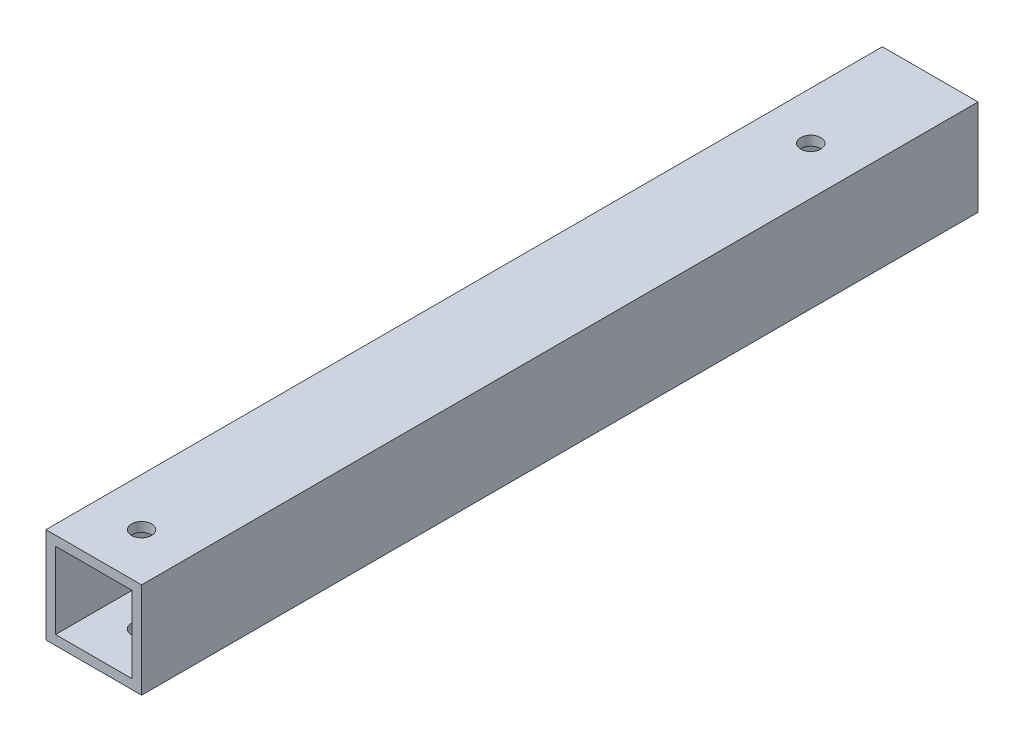
ISO-10303-21;
HEADER;
FILE_DESCRIPTION(('STEP AP214'),'2;1');
FILE_NAME('part.step','',(''),(''),'','','');
FILE_SCHEMA(('AUTOMOTIVE_DESIGN { 1 0 10303 214 1 1 1 1 }'));
ENDSEC;
DATA;
#1=APPLICATION_CONTEXT('core data for automotive mechanical design processes');
#2=APPLICATION_PROTOCOL_DEFINITION('international standard','automotive_design',2000,#1);
#3=PRODUCT_CONTEXT('',#1,'mechanical');
#4=PRODUCT('Part','Part','',(#3));
#5=PRODUCT_RELATED_PRODUCT_CATEGORY('part','',(#4));
#6=PRODUCT_DEFINITION_FORMATION('','',#4);
#7=PRODUCT_DEFINITION_CONTEXT('part definition',#1,'design');
#8=PRODUCT_DEFINITION('design','',#6,#7);
#9=PRODUCT_DEFINITION_SHAPE('','',#8);
#10=(LENGTH_UNIT() NAMED_UNIT(*) SI_UNIT(.MILLI.,.METRE.));
#11=(NAMED_UNIT(*) PLANE_ANGLE_UNIT() SI_UNIT($,.RADIAN.));
#12=(NAMED_UNIT(*) SI_UNIT($,.STERADIAN.) SOLID_ANGLE_UNIT());
#13=UNCERTAINTY_MEASURE_WITH_UNIT(LENGTH_MEASURE(1.E-05),#10,'distance_accuracy_value','');
#14=(GEOMETRIC_REPRESENTATION_CONTEXT(3) GLOBAL_UNCERTAINTY_ASSIGNED_CONTEXT((#13)) GLOBAL_UNIT_ASSIGNED_CONTEXT((#10,
#11,#12)) REPRESENTATION_CONTEXT('',''));
#15=CARTESIAN_POINT('',(0.,0.,0.));
#16=DIRECTION('',(0.,0.,1.));
#17=DIRECTION('',(1.,0.,0.));
#18=AXIS2_PLACEMENT_3D('',#15,#16,#17);
#19=CARTESIAN_POINT('',(0.,-10.,175.));
#20=DIRECTION('',(0.,1.,0.));
#21=DIRECTION('',(0.,0.,1.));
#22=AXIS2_PLACEMENT_3D('',#19,#20,#21);
#23=PLANE('',#22);
#24=CARTESIAN_POINT('',(0.,-10.,165.));
#25=DIRECTION('',(0.,1.,0.));
#26=DIRECTION('',(0.,0.,1.));
#27=AXIS2_PLACEMENT_3D('',#24,#25,#26);
#28=CIRCLE('',#27,2.1);
#29=CARTESIAN_POINT('',(0.,-10.,167.1));
#30=VERTEX_POINT('',#29);
#31=EDGE_CURVE('E172',#30,#30,#28,.T.);
#32=ORIENTED_EDGE('',*,*,#31,.T.);
#33=EDGE_LOOP('',(#32));
#34=FACE_BOUND('',#33,.T.);
#35=CARTESIAN_POINT('',(0.,-10.,25.));
#36=DIRECTION('',(0.,1.,0.));
#37=DIRECTION('',(0.,0.,1.));
#38=AXIS2_PLACEMENT_3D('',#35,#36,#37);
#39=CIRCLE('',#38,2.1);
#40=CARTESIAN_POINT('',(0.,-10.,27.1));
#41=VERTEX_POINT('',#40);
#42=EDGE_CURVE('E188',#41,#41,#39,.T.);
#43=ORIENTED_EDGE('',*,*,#42,.T.);
#44=EDGE_LOOP('',(#43));
#45=FACE_BOUND('',#44,.T.);
#46=DIRECTION('',(1.,0.,0.));
#47=VECTOR('',#46,1.);
#48=CARTESIAN_POINT('',(0.,-10.,0.));
#49=LINE('',#48,#47);
#50=CARTESIAN_POINT('',(-10.,-10.,0.));
#51=VERTEX_POINT('',#50);
#52=CARTESIAN_POINT('',(10.,-10.,0.));
#53=VERTEX_POINT('',#52);
#54=EDGE_CURVE('E152',#51,#53,#49,.T.);
#55=ORIENTED_EDGE('',*,*,#54,.T.);
#56=DIRECTION('',(0.,0.,-1.));
#57=VECTOR('',#56,1.);
#58=CARTESIAN_POINT('',(10.,-10.,175.));
#59=LINE('',#58,#57);
#60=CARTESIAN_POINT('',(10.,-10.,175.));
#61=VERTEX_POINT('',#60);
#62=EDGE_CURVE('E11',#61,#53,#59,.T.);
#63=ORIENTED_EDGE('',*,*,#62,.F.);
#64=DIRECTION('',(1.,0.,0.));
#65=VECTOR('',#64,1.);
#66=CARTESIAN_POINT('',(0.,-10.,175.));
#67=LINE('',#66,#65);
#68=CARTESIAN_POINT('',(-10.,-10.,175.));
#69=VERTEX_POINT('',#68);
#70=EDGE_CURVE('E123',#69,#61,#67,.T.);
#71=ORIENTED_EDGE('',*,*,#70,.F.);
#72=DIRECTION('',(0.,0.,-1.));
#73=VECTOR('',#72,1.);
#74=CARTESIAN_POINT('',(-10.,-10.,175.));
#75=LINE('',#74,#73);
#76=EDGE_CURVE('E62',#69,#51,#75,.T.);
#77=ORIENTED_EDGE('',*,*,#76,.T.);
#78=EDGE_LOOP('',(#55,#63,#71,#77));
#79=FACE_BOUND('',#78,.T.);
#80=ADVANCED_FACE('F43',(#34,#45,#79),#23,.F.);
#81=CARTESIAN_POINT('',(10.,0.,175.));
#82=DIRECTION('',(-1.,0.,0.));
#83=DIRECTION('',(0.,0.,1.));
#84=AXIS2_PLACEMENT_3D('',#81,#82,#83);
#85=PLANE('',#84);
#86=DIRECTION('',(0.,1.,0.));
#87=VECTOR('',#86,1.);
#88=CARTESIAN_POINT('',(10.,0.,0.));
#89=LINE('',#88,#87);
#90=CARTESIAN_POINT('',(10.,10.,0.));
#91=VERTEX_POINT('',#90);
#92=EDGE_CURVE('E129',#53,#91,#89,.T.);
#93=ORIENTED_EDGE('',*,*,#92,.T.);
#94=DIRECTION('',(0.,0.,-1.));
#95=VECTOR('',#94,1.);
#96=CARTESIAN_POINT('',(10.,10.,175.));
#97=LINE('',#96,#95);
#98=CARTESIAN_POINT('',(10.,10.,175.));
#99=VERTEX_POINT('',#98);
#100=EDGE_CURVE('E53',#99,#91,#97,.T.);
#101=ORIENTED_EDGE('',*,*,#100,.F.);
#102=DIRECTION('',(0.,1.,0.));
#103=VECTOR('',#102,1.);
#104=CARTESIAN_POINT('',(10.,0.,175.));
#105=LINE('',#104,#103);
#106=EDGE_CURVE('E117',#61,#99,#105,.T.);
#107=ORIENTED_EDGE('',*,*,#106,.F.);
#108=ORIENTED_EDGE('',*,*,#62,.T.);
#109=EDGE_LOOP('',(#93,#101,#107,#108));
#110=FACE_BOUND('',#109,.T.);
#111=ADVANCED_FACE('F128',(#110),#85,.F.);
#112=CARTESIAN_POINT('',(0.,10.,175.));
#113=DIRECTION('',(0.,1.,0.));
#114=DIRECTION('',(0.,0.,1.));
#115=AXIS2_PLACEMENT_3D('',#112,#113,#114);
#116=PLANE('',#115);
#117=CARTESIAN_POINT('',(0.,10.,165.));
#118=DIRECTION('',(0.,1.,0.));
#119=DIRECTION('',(0.,0.,1.));
#120=AXIS2_PLACEMENT_3D('',#117,#118,#119);
#121=CIRCLE('',#120,2.1);
#122=CARTESIAN_POINT('',(0.,10.,167.1));
#123=VERTEX_POINT('',#122);
#124=EDGE_CURVE('E178',#123,#123,#121,.T.);
#125=ORIENTED_EDGE('',*,*,#124,.F.);
#126=EDGE_LOOP('',(#125));
#127=FACE_BOUND('',#126,.T.);
#128=CARTESIAN_POINT('',(0.,10.,25.));
#129=DIRECTION('',(0.,1.,0.));
#130=DIRECTION('',(0.,0.,1.));
#131=AXIS2_PLACEMENT_3D('',#128,#129,#130);
#132=CIRCLE('',#131,2.1);
#133=CARTESIAN_POINT('',(0.,10.,27.1));
#134=VERTEX_POINT('',#133);
#135=EDGE_CURVE('E183',#134,#134,#132,.T.);
#136=ORIENTED_EDGE('',*,*,#135,.F.);
#137=EDGE_LOOP('',(#136));
#138=FACE_BOUND('',#137,.T.);
#139=DIRECTION('',(1.,0.,0.));
#140=VECTOR('',#139,1.);
#141=CARTESIAN_POINT('',(0.,10.,0.));
#142=LINE('',#141,#140);
#143=CARTESIAN_POINT('',(-10.,10.,0.));
#144=VERTEX_POINT('',#143);
#145=EDGE_CURVE('E155',#144,#91,#142,.T.);
#146=ORIENTED_EDGE('',*,*,#145,.F.);
#147=DIRECTION('',(0.,0.,-1.));
#148=VECTOR('',#147,1.);
#149=CARTESIAN_POINT('',(-10.,10.,175.));
#150=LINE('',#149,#148);
#151=CARTESIAN_POINT('',(-10.,10.,175.));
#152=VERTEX_POINT('',#151);
#153=EDGE_CURVE('E88',#152,#144,#150,.T.);
#154=ORIENTED_EDGE('',*,*,#153,.F.);
#155=DIRECTION('',(1.,0.,0.));
#156=VECTOR('',#155,1.);
#157=CARTESIAN_POINT('',(0.,10.,175.));
#158=LINE('',#157,#156);
#159=EDGE_CURVE('E122',#152,#99,#158,.T.);
#160=ORIENTED_EDGE('',*,*,#159,.T.);
#161=ORIENTED_EDGE('',*,*,#100,.T.);
#162=EDGE_LOOP('',(#146,#154,#160,#161));
#163=FACE_BOUND('',#162,.T.);
#164=ADVANCED_FACE('F133',(#127,#138,#163),#116,.T.);
#165=CARTESIAN_POINT('',(8.,0.,175.));
#166=DIRECTION('',(-1.,0.,0.));
#167=DIRECTION('',(0.,0.,1.));
#168=AXIS2_PLACEMENT_3D('',#165,#166,#167);
#169=PLANE('',#168);
#170=DIRECTION('',(0.,1.,0.));
#171=VECTOR('',#170,1.);
#172=CARTESIAN_POINT('',(8.,0.,0.));
#173=LINE('',#172,#171);
#174=CARTESIAN_POINT('',(8.,-8.,0.));
#175=VERTEX_POINT('',#174);
#176=CARTESIAN_POINT('',(8.,8.,0.));
#177=VERTEX_POINT('',#176);
#178=EDGE_CURVE('E140',#175,#177,#173,.T.);
#179=ORIENTED_EDGE('',*,*,#178,.F.);
#180=DIRECTION('',(0.,0.,-1.));
#181=VECTOR('',#180,1.);
#182=CARTESIAN_POINT('',(8.,-8.,175.));
#183=LINE('',#182,#181);
#184=CARTESIAN_POINT('',(8.,-8.,175.));
#185=VERTEX_POINT('',#184);
#186=EDGE_CURVE('E100',#185,#175,#183,.T.);
#187=ORIENTED_EDGE('',*,*,#186,.F.);
#188=DIRECTION('',(0.,1.,0.));
#189=VECTOR('',#188,1.);
#190=CARTESIAN_POINT('',(8.,0.,175.));
#191=LINE('',#190,#189);
#192=CARTESIAN_POINT('',(8.,8.,175.));
#193=VERTEX_POINT('',#192);
#194=EDGE_CURVE('E160',#185,#193,#191,.T.);
#195=ORIENTED_EDGE('',*,*,#194,.T.);
#196=DIRECTION('',(0.,0.,-1.));
#197=VECTOR('',#196,1.);
#198=CARTESIAN_POINT('',(8.,8.,175.));
#199=LINE('',#198,#197);
#200=EDGE_CURVE('E136',#193,#177,#199,.T.);
#201=ORIENTED_EDGE('',*,*,#200,.T.);
#202=EDGE_LOOP('',(#179,#187,#195,#201));
#203=FACE_BOUND('',#202,.T.);
#204=ADVANCED_FACE('F45',(#203),#169,.T.);
#205=CARTESIAN_POINT('',(0.,-8.,175.));
#206=DIRECTION('',(0.,1.,0.));
#207=DIRECTION('',(0.,0.,1.));
#208=AXIS2_PLACEMENT_3D('',#205,#206,#207);
#209=PLANE('',#208);
#210=CARTESIAN_POINT('',(0.,-8.,165.));
#211=DIRECTION('',(0.,1.,0.));
#212=DIRECTION('',(0.,0.,1.));
#213=AXIS2_PLACEMENT_3D('',#210,#211,#212);
#214=CIRCLE('',#213,2.1);
#215=CARTESIAN_POINT('',(0.,-8.,167.1));
#216=VERTEX_POINT('',#215);
#217=EDGE_CURVE('E144',#216,#216,#214,.T.);
#218=ORIENTED_EDGE('',*,*,#217,.F.);
#219=EDGE_LOOP('',(#218));
#220=FACE_BOUND('',#219,.T.);
#221=CARTESIAN_POINT('',(0.,-8.,25.));
#222=DIRECTION('',(0.,1.,0.));
#223=DIRECTION('',(0.,0.,1.));
#224=AXIS2_PLACEMENT_3D('',#221,#222,#223);
#225=CIRCLE('',#224,2.1);
#226=CARTESIAN_POINT('',(0.,-8.,27.1));
#227=VERTEX_POINT('',#226);
#228=EDGE_CURVE('E171',#227,#227,#225,.T.);
#229=ORIENTED_EDGE('',*,*,#228,.F.);
#230=EDGE_LOOP('',(#229));
#231=FACE_BOUND('',#230,.T.);
#232=DIRECTION('',(1.,0.,0.));
#233=VECTOR('',#232,1.);
#234=CARTESIAN_POINT('',(0.,-8.,0.));
#235=LINE('',#234,#233);
#236=CARTESIAN_POINT('',(-8.,-8.,0.));
#237=VERTEX_POINT('',#236);
#238=EDGE_CURVE('E143',#237,#175,#235,.T.);
#239=ORIENTED_EDGE('',*,*,#238,.F.);
#240=DIRECTION('',(0.,0.,-1.));
#241=VECTOR('',#240,1.);
#242=CARTESIAN_POINT('',(-8.,-8.,175.));
#243=LINE('',#242,#241);
#244=CARTESIAN_POINT('',(-8.,-8.,175.));
#245=VERTEX_POINT('',#244);
#246=EDGE_CURVE('E167',#245,#237,#243,.T.);
#247=ORIENTED_EDGE('',*,*,#246,.F.);
#248=DIRECTION('',(1.,0.,0.));
#249=VECTOR('',#248,1.);
#250=CARTESIAN_POINT('',(0.,-8.,175.));
#251=LINE('',#250,#249);
#252=EDGE_CURVE('E194',#245,#185,#251,.T.);
#253=ORIENTED_EDGE('',*,*,#252,.T.);
#254=ORIENTED_EDGE('',*,*,#186,.T.);
#255=EDGE_LOOP('',(#239,#247,#253,#254));
#256=FACE_BOUND('',#255,.T.);
#257=ADVANCED_FACE('F210',(#220,#231,#256),#209,.T.);
#258=CARTESIAN_POINT('',(-8.,0.,175.));
#259=DIRECTION('',(-1.,0.,0.));
#260=DIRECTION('',(0.,0.,1.));
#261=AXIS2_PLACEMENT_3D('',#258,#259,#260);
#262=PLANE('',#261);
#263=DIRECTION('',(0.,1.,0.));
#264=VECTOR('',#263,1.);
#265=CARTESIAN_POINT('',(-8.,0.,0.));
#266=LINE('',#265,#264);
#267=CARTESIAN_POINT('',(-8.,8.,0.));
#268=VERTEX_POINT('',#267);
#269=EDGE_CURVE('E147',#237,#268,#266,.T.);
#270=ORIENTED_EDGE('',*,*,#269,.T.);
#271=DIRECTION('',(0.,0.,-1.));
#272=VECTOR('',#271,1.);
#273=CARTESIAN_POINT('',(-8.,8.,175.));
#274=LINE('',#273,#272);
#275=CARTESIAN_POINT('',(-8.,8.,175.));
#276=VERTEX_POINT('',#275);
#277=EDGE_CURVE('E164',#276,#268,#274,.T.);
#278=ORIENTED_EDGE('',*,*,#277,.F.);
#279=DIRECTION('',(0.,1.,0.));
#280=VECTOR('',#279,1.);
#281=CARTESIAN_POINT('',(-8.,0.,175.));
#282=LINE('',#281,#280);
#283=EDGE_CURVE('E197',#245,#276,#282,.T.);
#284=ORIENTED_EDGE('',*,*,#283,.F.);
#285=ORIENTED_EDGE('',*,*,#246,.T.);
#286=EDGE_LOOP('',(#270,#278,#284,#285));
#287=FACE_BOUND('',#286,.T.);
#288=ADVANCED_FACE('F216',(#287),#262,.F.);
#289=CARTESIAN_POINT('',(0.,8.,175.));
#290=DIRECTION('',(0.,1.,0.));
#291=DIRECTION('',(0.,0.,1.));
#292=AXIS2_PLACEMENT_3D('',#289,#290,#291);
#293=PLANE('',#292);
#294=CARTESIAN_POINT('',(0.,7.99999999999999,165.));
#295=DIRECTION('',(0.,1.,0.));
#296=DIRECTION('',(0.,0.,1.));
#297=AXIS2_PLACEMENT_3D('',#294,#295,#296);
#298=CIRCLE('',#297,2.1);
#299=CARTESIAN_POINT('',(0.,7.99999999999999,167.1));
#300=VERTEX_POINT('',#299);
#301=EDGE_CURVE('E47',#300,#300,#298,.T.);
#302=ORIENTED_EDGE('',*,*,#301,.T.);
#303=EDGE_LOOP('',(#302));
#304=FACE_BOUND('',#303,.T.);
#305=CARTESIAN_POINT('',(0.,7.99999999999999,25.));
#306=DIRECTION('',(0.,1.,0.));
#307=DIRECTION('',(0.,0.,1.));
#308=AXIS2_PLACEMENT_3D('',#305,#306,#307);
#309=CIRCLE('',#308,2.1);
#310=CARTESIAN_POINT('',(0.,7.99999999999999,27.1));
#311=VERTEX_POINT('',#310);
#312=EDGE_CURVE('E169',#311,#311,#309,.T.);
#313=ORIENTED_EDGE('',*,*,#312,.T.);
#314=EDGE_LOOP('',(#313));
#315=FACE_BOUND('',#314,.T.);
#316=DIRECTION('',(1.,0.,0.));
#317=VECTOR('',#316,1.);
#318=CARTESIAN_POINT('',(0.,8.,0.));
#319=LINE('',#318,#317);
#320=EDGE_CURVE('E149',#268,#177,#319,.T.);
#321=ORIENTED_EDGE('',*,*,#320,.T.);
#322=ORIENTED_EDGE('',*,*,#200,.F.);
#323=DIRECTION('',(1.,0.,0.));
#324=VECTOR('',#323,1.);
#325=CARTESIAN_POINT('',(0.,8.,175.));
#326=LINE('',#325,#324);
#327=EDGE_CURVE('E199',#276,#193,#326,.T.);
#328=ORIENTED_EDGE('',*,*,#327,.F.);
#329=ORIENTED_EDGE('',*,*,#277,.T.);
#330=EDGE_LOOP('',(#321,#322,#328,#329));
#331=FACE_BOUND('',#330,.T.);
#332=ADVANCED_FACE('F207',(#304,#315,#331),#293,.F.);
#333=CARTESIAN_POINT('',(-10.,0.,175.));
#334=DIRECTION('',(-1.,0.,0.));
#335=DIRECTION('',(0.,0.,1.));
#336=AXIS2_PLACEMENT_3D('',#333,#334,#335);
#337=PLANE('',#336);
#338=DIRECTION('',(0.,1.,0.));
#339=VECTOR('',#338,1.);
#340=CARTESIAN_POINT('',(-10.,0.,0.));
#341=LINE('',#340,#339);
#342=EDGE_CURVE('E157',#51,#144,#341,.T.);
#343=ORIENTED_EDGE('',*,*,#342,.F.);
#344=ORIENTED_EDGE('',*,*,#76,.F.);
#345=DIRECTION('',(0.,1.,0.));
#346=VECTOR('',#345,1.);
#347=CARTESIAN_POINT('',(-10.,0.,175.));
#348=LINE('',#347,#346);
#349=EDGE_CURVE('E134',#69,#152,#348,.T.);
#350=ORIENTED_EDGE('',*,*,#349,.T.);
#351=ORIENTED_EDGE('',*,*,#153,.T.);
#352=EDGE_LOOP('',(#343,#344,#350,#351));
#353=FACE_BOUND('',#352,.T.);
#354=ADVANCED_FACE('F231',(#353),#337,.T.);
#355=CARTESIAN_POINT('',(0.,0.,175.));
#356=DIRECTION('',(0.,0.,1.));
#357=DIRECTION('',(1.,0.,0.));
#358=AXIS2_PLACEMENT_3D('',#355,#356,#357);
#359=PLANE('',#358);
#360=ORIENTED_EDGE('',*,*,#194,.F.);
#361=ORIENTED_EDGE('',*,*,#252,.F.);
#362=ORIENTED_EDGE('',*,*,#283,.T.);
#363=ORIENTED_EDGE('',*,*,#327,.T.);
#364=EDGE_LOOP('',(#360,#361,#362,#363));
#365=FACE_BOUND('',#364,.T.);
#366=ORIENTED_EDGE('',*,*,#70,.T.);
#367=ORIENTED_EDGE('',*,*,#106,.T.);
#368=ORIENTED_EDGE('',*,*,#159,.F.);
#369=ORIENTED_EDGE('',*,*,#349,.F.);
#370=EDGE_LOOP('',(#366,#367,#368,#369));
#371=FACE_BOUND('',#370,.T.);
#372=ADVANCED_FACE('F119',(#365,#371),#359,.T.);
#373=CARTESIAN_POINT('',(0.,0.,0.));
#374=DIRECTION('',(0.,0.,1.));
#375=DIRECTION('',(1.,0.,0.));
#376=AXIS2_PLACEMENT_3D('',#373,#374,#375);
#377=PLANE('',#376);
#378=ORIENTED_EDGE('',*,*,#178,.T.);
#379=ORIENTED_EDGE('',*,*,#320,.F.);
#380=ORIENTED_EDGE('',*,*,#269,.F.);
#381=ORIENTED_EDGE('',*,*,#238,.T.);
#382=EDGE_LOOP('',(#378,#379,#380,#381));
#383=FACE_BOUND('',#382,.T.);
#384=ORIENTED_EDGE('',*,*,#54,.F.);
#385=ORIENTED_EDGE('',*,*,#342,.T.);
#386=ORIENTED_EDGE('',*,*,#145,.T.);
#387=ORIENTED_EDGE('',*,*,#92,.F.);
#388=EDGE_LOOP('',(#384,#385,#386,#387));
#389=FACE_BOUND('',#388,.T.);
#390=ADVANCED_FACE('F240',(#383,#389),#377,.F.);
#391=CARTESIAN_POINT('',(0.,-10.,25.));
#392=DIRECTION('',(0.,1.,0.));
#393=DIRECTION('',(0.,0.,1.));
#394=AXIS2_PLACEMENT_3D('',#391,#392,#393);
#395=CYLINDRICAL_SURFACE('',#394,2.1);
#396=ORIENTED_EDGE('',*,*,#135,.T.);
#397=EDGE_LOOP('',(#396));
#398=FACE_BOUND('',#397,.T.);
#399=ORIENTED_EDGE('',*,*,#312,.F.);
#400=EDGE_LOOP('',(#399));
#401=FACE_BOUND('',#400,.T.);
#402=ADVANCED_FACE('F243',(#398,#401),#395,.F.);
#403=CARTESIAN_POINT('',(0.,-10.,165.));
#404=DIRECTION('',(0.,1.,0.));
#405=DIRECTION('',(0.,0.,1.));
#406=AXIS2_PLACEMENT_3D('',#403,#404,#405);
#407=CYLINDRICAL_SURFACE('',#406,2.1);
#408=ORIENTED_EDGE('',*,*,#124,.T.);
#409=EDGE_LOOP('',(#408));
#410=FACE_BOUND('',#409,.T.);
#411=ORIENTED_EDGE('',*,*,#301,.F.);
#412=EDGE_LOOP('',(#411));
#413=FACE_BOUND('',#412,.T.);
#414=ADVANCED_FACE('F255',(#410,#413),#407,.F.);
#415=ORIENTED_EDGE('',*,*,#228,.T.);
#416=EDGE_LOOP('',(#415));
#417=FACE_BOUND('',#416,.T.);
#418=ORIENTED_EDGE('',*,*,#42,.F.);
#419=EDGE_LOOP('',(#418));
#420=FACE_BOUND('',#419,.T.);
#421=ADVANCED_FACE('F251',(#417,#420),#395,.F.);
#422=ORIENTED_EDGE('',*,*,#217,.T.);
#423=EDGE_LOOP('',(#422));
#424=FACE_BOUND('',#423,.T.);
#425=ORIENTED_EDGE('',*,*,#31,.F.);
#426=EDGE_LOOP('',(#425));
#427=FACE_BOUND('',#426,.T.);
#428=ADVANCED_FACE('F254',(#424,#427),#407,.F.);
#429=CLOSED_SHELL('',(#80,#111,#164,#204,#257,#288,#332,#354,#372,#390,#402,#414,#421,#428));
#430=MANIFOLD_SOLID_BREP('B2',#429);
#431=ADVANCED_BREP_SHAPE_REPRESENTATION('',(#18,#430),#14);
#432=SHAPE_DEFINITION_REPRESENTATION(#9,#431);
ENDSEC;
END-ISO-10303-21;
